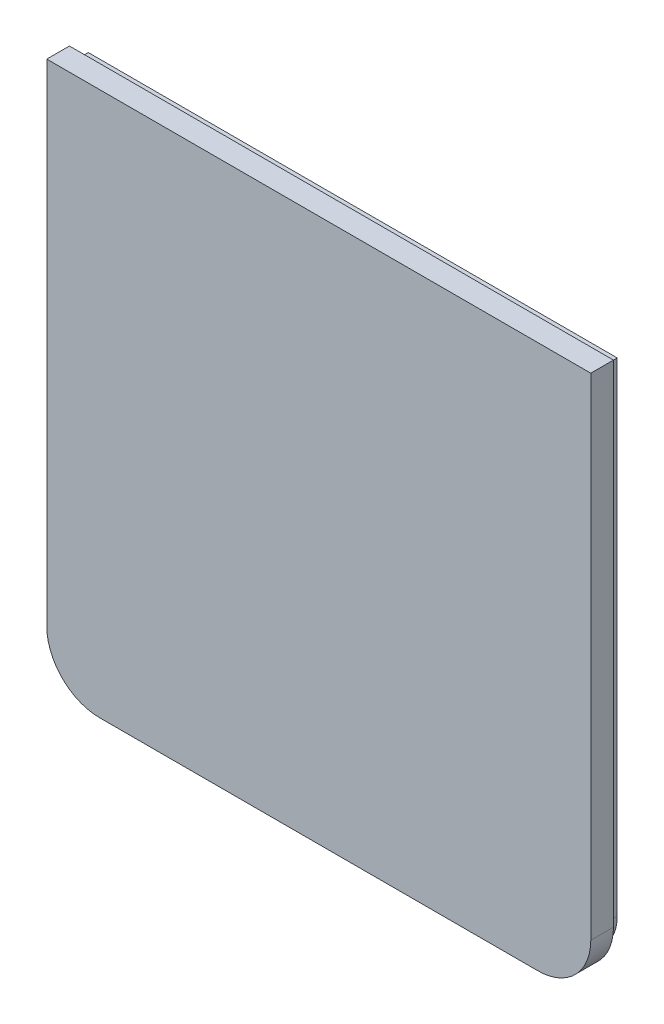
ISO-10303-21;
HEADER;
FILE_DESCRIPTION(('STEP AP214'),'2;1');
FILE_NAME('part.step','',(''),(''),'','','');
FILE_SCHEMA(('AUTOMOTIVE_DESIGN { 1 0 10303 214 1 1 1 1 }'));
ENDSEC;
DATA;
#1=APPLICATION_CONTEXT('core data for automotive mechanical design processes');
#2=APPLICATION_PROTOCOL_DEFINITION('international standard','automotive_design',2000,#1);
#3=PRODUCT_CONTEXT('',#1,'mechanical');
#4=PRODUCT('Part','Part','',(#3));
#5=PRODUCT_RELATED_PRODUCT_CATEGORY('part','',(#4));
#6=PRODUCT_DEFINITION_FORMATION('','',#4);
#7=PRODUCT_DEFINITION_CONTEXT('part definition',#1,'design');
#8=PRODUCT_DEFINITION('design','',#6,#7);
#9=PRODUCT_DEFINITION_SHAPE('','',#8);
#10=(LENGTH_UNIT() NAMED_UNIT(*) SI_UNIT(.MILLI.,.METRE.));
#11=(NAMED_UNIT(*) PLANE_ANGLE_UNIT() SI_UNIT($,.RADIAN.));
#12=(NAMED_UNIT(*) SI_UNIT($,.STERADIAN.) SOLID_ANGLE_UNIT());
#13=UNCERTAINTY_MEASURE_WITH_UNIT(LENGTH_MEASURE(1.E-05),#10,'distance_accuracy_value','');
#14=(GEOMETRIC_REPRESENTATION_CONTEXT(3) GLOBAL_UNCERTAINTY_ASSIGNED_CONTEXT((#13)) GLOBAL_UNIT_ASSIGNED_CONTEXT((#10,
#11,#12)) REPRESENTATION_CONTEXT('',''));
#15=CARTESIAN_POINT('',(0.,0.,0.));
#16=DIRECTION('',(0.,0.,1.));
#17=DIRECTION('',(1.,0.,0.));
#18=AXIS2_PLACEMENT_3D('',#15,#16,#17);
#19=CARTESIAN_POINT('',(-58.,-58.,0.));
#20=DIRECTION('',(0.,0.,-1.));
#21=DIRECTION('',(-1.,0.,0.));
#22=AXIS2_PLACEMENT_3D('',#19,#20,#21);
#23=PLANE('',#22);
#24=DIRECTION('',(0.,1.,0.));
#25=VECTOR('',#24,1.);
#26=CARTESIAN_POINT('',(72.,-57.9999999999999,0.));
#27=LINE('',#26,#25);
#28=CARTESIAN_POINT('',(72.,-58.,0.));
#29=VERTEX_POINT('',#28);
#30=CARTESIAN_POINT('',(72.,72.,0.));
#31=VERTEX_POINT('',#30);
#32=EDGE_CURVE('E258',#29,#31,#27,.T.);
#33=ORIENTED_EDGE('',*,*,#32,.F.);
#34=CARTESIAN_POINT('',(58.,-58.,0.));
#35=DIRECTION('',(0.,0.,1.));
#36=DIRECTION('',(1.,0.,0.));
#37=AXIS2_PLACEMENT_3D('',#34,#35,#36);
#38=CIRCLE('',#37,14.);
#39=CARTESIAN_POINT('',(57.9999999999999,-72.,0.));
#40=VERTEX_POINT('',#39);
#41=EDGE_CURVE('E263',#40,#29,#38,.T.);
#42=ORIENTED_EDGE('',*,*,#41,.F.);
#43=DIRECTION('',(1.,0.,0.));
#44=VECTOR('',#43,1.);
#45=CARTESIAN_POINT('',(-57.9999999999999,-72.,0.));
#46=LINE('',#45,#44);
#47=CARTESIAN_POINT('',(-57.9999999999999,-72.,0.));
#48=VERTEX_POINT('',#47);
#49=EDGE_CURVE('E282',#48,#40,#46,.T.);
#50=ORIENTED_EDGE('',*,*,#49,.F.);
#51=CARTESIAN_POINT('',(-58.,-58.,0.));
#52=DIRECTION('',(0.,0.,1.));
#53=DIRECTION('',(-1.,0.,0.));
#54=AXIS2_PLACEMENT_3D('',#51,#52,#53);
#55=CIRCLE('',#54,14.);
#56=CARTESIAN_POINT('',(-72.,-57.9999999999999,0.));
#57=VERTEX_POINT('',#56);
#58=EDGE_CURVE('E280',#57,#48,#55,.T.);
#59=ORIENTED_EDGE('',*,*,#58,.F.);
#60=DIRECTION('',(0.,-1.,0.));
#61=VECTOR('',#60,1.);
#62=CARTESIAN_POINT('',(-72.,-57.9999999999999,0.));
#63=LINE('',#62,#61);
#64=CARTESIAN_POINT('',(-72.,72.,0.));
#65=VERTEX_POINT('',#64);
#66=EDGE_CURVE('E278',#65,#57,#63,.T.);
#67=ORIENTED_EDGE('',*,*,#66,.F.);
#68=DIRECTION('',(-1.,0.,0.));
#69=VECTOR('',#68,1.);
#70=CARTESIAN_POINT('',(-72.,72.,0.));
#71=LINE('',#70,#69);
#72=EDGE_CURVE('E276',#31,#65,#71,.T.);
#73=ORIENTED_EDGE('',*,*,#72,.F.);
#74=EDGE_LOOP('',(#33,#42,#50,#59,#67,#73));
#75=FACE_BOUND('',#74,.T.);
#76=DIRECTION('',(0.,-1.,0.));
#77=VECTOR('',#76,1.);
#78=CARTESIAN_POINT('',(70.,70.,0.));
#79=LINE('',#78,#77);
#80=CARTESIAN_POINT('',(70.,70.,0.));
#81=VERTEX_POINT('',#80);
#82=CARTESIAN_POINT('',(70.,-58.,0.));
#83=VERTEX_POINT('',#82);
#84=EDGE_CURVE('E235',#81,#83,#79,.T.);
#85=ORIENTED_EDGE('',*,*,#84,.F.);
#86=DIRECTION('',(1.,0.,0.));
#87=VECTOR('',#86,1.);
#88=CARTESIAN_POINT('',(-70.,70.,0.));
#89=LINE('',#88,#87);
#90=CARTESIAN_POINT('',(-70.,70.,0.));
#91=VERTEX_POINT('',#90);
#92=EDGE_CURVE('E181',#91,#81,#89,.T.);
#93=ORIENTED_EDGE('',*,*,#92,.F.);
#94=DIRECTION('',(0.,1.,0.));
#95=VECTOR('',#94,1.);
#96=CARTESIAN_POINT('',(-70.,-58.,0.));
#97=LINE('',#96,#95);
#98=CARTESIAN_POINT('',(-70.,-58.,0.));
#99=VERTEX_POINT('',#98);
#100=EDGE_CURVE('E222',#99,#91,#97,.T.);
#101=ORIENTED_EDGE('',*,*,#100,.F.);
#102=CARTESIAN_POINT('',(-58.,-58.,0.));
#103=DIRECTION('',(0.,0.,-1.));
#104=DIRECTION('',(-1.,0.,0.));
#105=AXIS2_PLACEMENT_3D('',#102,#103,#104);
#106=CIRCLE('',#105,12.);
#107=CARTESIAN_POINT('',(-57.9999999999999,-70.,0.));
#108=VERTEX_POINT('',#107);
#109=EDGE_CURVE('E241',#108,#99,#106,.T.);
#110=ORIENTED_EDGE('',*,*,#109,.F.);
#111=DIRECTION('',(-1.,0.,0.));
#112=VECTOR('',#111,1.);
#113=CARTESIAN_POINT('',(58.,-70.,0.));
#114=LINE('',#113,#112);
#115=CARTESIAN_POINT('',(58.,-70.,0.));
#116=VERTEX_POINT('',#115);
#117=EDGE_CURVE('E239',#116,#108,#114,.T.);
#118=ORIENTED_EDGE('',*,*,#117,.F.);
#119=CARTESIAN_POINT('',(58.,-58.,0.));
#120=DIRECTION('',(0.,0.,-1.));
#121=DIRECTION('',(-1.,0.,0.));
#122=AXIS2_PLACEMENT_3D('',#119,#120,#121);
#123=CIRCLE('',#122,12.);
#124=EDGE_CURVE('E237',#83,#116,#123,.T.);
#125=ORIENTED_EDGE('',*,*,#124,.F.);
#126=EDGE_LOOP('',(#85,#93,#101,#110,#118,#125));
#127=FACE_BOUND('',#126,.T.);
#128=ADVANCED_FACE('F37',(#75,#127),#23,.T.);
#129=CARTESIAN_POINT('',(72.,-57.9999999999999,6.));
#130=DIRECTION('',(-1.,0.,0.));
#131=DIRECTION('',(0.,0.,1.));
#132=AXIS2_PLACEMENT_3D('',#129,#130,#131);
#133=PLANE('',#132);
#134=ORIENTED_EDGE('',*,*,#32,.T.);
#135=DIRECTION('',(0.,0.,-1.));
#136=VECTOR('',#135,1.);
#137=CARTESIAN_POINT('',(72.,72.,6.));
#138=LINE('',#137,#136);
#139=CARTESIAN_POINT('',(72.,72.,6.));
#140=VERTEX_POINT('',#139);
#141=EDGE_CURVE('E11',#140,#31,#138,.T.);
#142=ORIENTED_EDGE('',*,*,#141,.F.);
#143=DIRECTION('',(0.,1.,0.));
#144=VECTOR('',#143,1.);
#145=CARTESIAN_POINT('',(72.,-57.9999999999999,6.));
#146=LINE('',#145,#144);
#147=CARTESIAN_POINT('',(72.,-58.,6.));
#148=VERTEX_POINT('',#147);
#149=EDGE_CURVE('E259',#148,#140,#146,.T.);
#150=ORIENTED_EDGE('',*,*,#149,.F.);
#151=DIRECTION('',(0.,0.,-1.));
#152=VECTOR('',#151,1.);
#153=CARTESIAN_POINT('',(72.,-58.,6.));
#154=LINE('',#153,#152);
#155=EDGE_CURVE('E273',#148,#29,#154,.T.);
#156=ORIENTED_EDGE('',*,*,#155,.T.);
#157=EDGE_LOOP('',(#134,#142,#150,#156));
#158=FACE_BOUND('',#157,.T.);
#159=ADVANCED_FACE('F39',(#158),#133,.F.);
#160=CARTESIAN_POINT('',(-72.,72.,6.));
#161=DIRECTION('',(0.,-1.,0.));
#162=DIRECTION('',(0.,0.,-1.));
#163=AXIS2_PLACEMENT_3D('',#160,#161,#162);
#164=PLANE('',#163);
#165=ORIENTED_EDGE('',*,*,#72,.T.);
#166=DIRECTION('',(0.,0.,-1.));
#167=VECTOR('',#166,1.);
#168=CARTESIAN_POINT('',(-72.,72.,6.));
#169=LINE('',#168,#167);
#170=CARTESIAN_POINT('',(-72.,72.,6.));
#171=VERTEX_POINT('',#170);
#172=EDGE_CURVE('E45',#171,#65,#169,.T.);
#173=ORIENTED_EDGE('',*,*,#172,.F.);
#174=DIRECTION('',(-1.,0.,0.));
#175=VECTOR('',#174,1.);
#176=CARTESIAN_POINT('',(-72.,72.,6.));
#177=LINE('',#176,#175);
#178=EDGE_CURVE('E262',#140,#171,#177,.T.);
#179=ORIENTED_EDGE('',*,*,#178,.F.);
#180=ORIENTED_EDGE('',*,*,#141,.T.);
#181=EDGE_LOOP('',(#165,#173,#179,#180));
#182=FACE_BOUND('',#181,.T.);
#183=ADVANCED_FACE('F323',(#182),#164,.F.);
#184=CARTESIAN_POINT('',(-72.,-57.9999999999999,6.));
#185=DIRECTION('',(1.,0.,0.));
#186=DIRECTION('',(0.,0.,-1.));
#187=AXIS2_PLACEMENT_3D('',#184,#185,#186);
#188=PLANE('',#187);
#189=ORIENTED_EDGE('',*,*,#66,.T.);
#190=DIRECTION('',(0.,0.,-1.));
#191=VECTOR('',#190,1.);
#192=CARTESIAN_POINT('',(-72.,-57.9999999999999,6.));
#193=LINE('',#192,#191);
#194=CARTESIAN_POINT('',(-72.,-57.9999999999999,6.));
#195=VERTEX_POINT('',#194);
#196=EDGE_CURVE('E293',#195,#57,#193,.T.);
#197=ORIENTED_EDGE('',*,*,#196,.F.);
#198=DIRECTION('',(0.,-1.,0.));
#199=VECTOR('',#198,1.);
#200=CARTESIAN_POINT('',(-72.,-57.9999999999999,6.));
#201=LINE('',#200,#199);
#202=EDGE_CURVE('E265',#171,#195,#201,.T.);
#203=ORIENTED_EDGE('',*,*,#202,.F.);
#204=ORIENTED_EDGE('',*,*,#172,.T.);
#205=EDGE_LOOP('',(#189,#197,#203,#204));
#206=FACE_BOUND('',#205,.T.);
#207=ADVANCED_FACE('F300',(#206),#188,.F.);
#208=CARTESIAN_POINT('',(-58.,-58.,6.));
#209=DIRECTION('',(0.,0.,-1.));
#210=DIRECTION('',(-1.,0.,0.));
#211=AXIS2_PLACEMENT_3D('',#208,#209,#210);
#212=CYLINDRICAL_SURFACE('',#211,14.);
#213=ORIENTED_EDGE('',*,*,#58,.T.);
#214=DIRECTION('',(0.,0.,-1.));
#215=VECTOR('',#214,1.);
#216=CARTESIAN_POINT('',(-57.9999999999999,-72.,6.));
#217=LINE('',#216,#215);
#218=CARTESIAN_POINT('',(-57.9999999999999,-72.,6.));
#219=VERTEX_POINT('',#218);
#220=EDGE_CURVE('E290',#219,#48,#217,.T.);
#221=ORIENTED_EDGE('',*,*,#220,.F.);
#222=CARTESIAN_POINT('',(-58.,-58.,6.));
#223=DIRECTION('',(0.,0.,1.));
#224=DIRECTION('',(-1.,0.,0.));
#225=AXIS2_PLACEMENT_3D('',#222,#223,#224);
#226=CIRCLE('',#225,14.);
#227=EDGE_CURVE('E267',#195,#219,#226,.T.);
#228=ORIENTED_EDGE('',*,*,#227,.F.);
#229=ORIENTED_EDGE('',*,*,#196,.T.);
#230=EDGE_LOOP('',(#213,#221,#228,#229));
#231=FACE_BOUND('',#230,.T.);
#232=ADVANCED_FACE('F311',(#231),#212,.T.);
#233=CARTESIAN_POINT('',(-57.9999999999999,-72.,6.));
#234=DIRECTION('',(0.,1.,0.));
#235=DIRECTION('',(0.,0.,1.));
#236=AXIS2_PLACEMENT_3D('',#233,#234,#235);
#237=PLANE('',#236);
#238=ORIENTED_EDGE('',*,*,#49,.T.);
#239=DIRECTION('',(0.,0.,-1.));
#240=VECTOR('',#239,1.);
#241=CARTESIAN_POINT('',(57.9999999999999,-72.,6.));
#242=LINE('',#241,#240);
#243=CARTESIAN_POINT('',(57.9999999999999,-72.,6.));
#244=VERTEX_POINT('',#243);
#245=EDGE_CURVE('E287',#244,#40,#242,.T.);
#246=ORIENTED_EDGE('',*,*,#245,.F.);
#247=DIRECTION('',(1.,0.,0.));
#248=VECTOR('',#247,1.);
#249=CARTESIAN_POINT('',(-57.9999999999999,-72.,6.));
#250=LINE('',#249,#248);
#251=EDGE_CURVE('E269',#219,#244,#250,.T.);
#252=ORIENTED_EDGE('',*,*,#251,.F.);
#253=ORIENTED_EDGE('',*,*,#220,.T.);
#254=EDGE_LOOP('',(#238,#246,#252,#253));
#255=FACE_BOUND('',#254,.T.);
#256=ADVANCED_FACE('F315',(#255),#237,.F.);
#257=CARTESIAN_POINT('',(58.,-58.,6.));
#258=DIRECTION('',(0.,0.,-1.));
#259=DIRECTION('',(-1.,0.,0.));
#260=AXIS2_PLACEMENT_3D('',#257,#258,#259);
#261=CYLINDRICAL_SURFACE('',#260,14.);
#262=ORIENTED_EDGE('',*,*,#41,.T.);
#263=ORIENTED_EDGE('',*,*,#155,.F.);
#264=CARTESIAN_POINT('',(58.,-58.,6.));
#265=DIRECTION('',(0.,0.,1.));
#266=DIRECTION('',(1.,0.,0.));
#267=AXIS2_PLACEMENT_3D('',#264,#265,#266);
#268=CIRCLE('',#267,14.);
#269=EDGE_CURVE('E271',#244,#148,#268,.T.);
#270=ORIENTED_EDGE('',*,*,#269,.F.);
#271=ORIENTED_EDGE('',*,*,#245,.T.);
#272=EDGE_LOOP('',(#262,#263,#270,#271));
#273=FACE_BOUND('',#272,.T.);
#274=ADVANCED_FACE('F326',(#273),#261,.T.);
#275=CARTESIAN_POINT('',(-58.,-58.,6.));
#276=DIRECTION('',(0.,0.,-1.));
#277=DIRECTION('',(-1.,0.,0.));
#278=AXIS2_PLACEMENT_3D('',#275,#276,#277);
#279=PLANE('',#278);
#280=ORIENTED_EDGE('',*,*,#149,.T.);
#281=ORIENTED_EDGE('',*,*,#178,.T.);
#282=ORIENTED_EDGE('',*,*,#202,.T.);
#283=ORIENTED_EDGE('',*,*,#227,.T.);
#284=ORIENTED_EDGE('',*,*,#251,.T.);
#285=ORIENTED_EDGE('',*,*,#269,.T.);
#286=EDGE_LOOP('',(#280,#281,#282,#283,#284,#285));
#287=FACE_BOUND('',#286,.T.);
#288=ADVANCED_FACE('F319',(#287),#279,.F.);
#289=CARTESIAN_POINT('',(58.,-58.,-3.));
#290=DIRECTION('',(0.,0.,-1.));
#291=DIRECTION('',(-1.,0.,0.));
#292=AXIS2_PLACEMENT_3D('',#289,#290,#291);
#293=PLANE('',#292);
#294=DIRECTION('',(1.,0.,0.));
#295=VECTOR('',#294,1.);
#296=CARTESIAN_POINT('',(-70.,70.,-3.));
#297=LINE('',#296,#295);
#298=CARTESIAN_POINT('',(-70.,70.,-3.));
#299=VERTEX_POINT('',#298);
#300=CARTESIAN_POINT('',(70.,70.,-3.));
#301=VERTEX_POINT('',#300);
#302=EDGE_CURVE('E218',#299,#301,#297,.T.);
#303=ORIENTED_EDGE('',*,*,#302,.T.);
#304=DIRECTION('',(0.,-1.,0.));
#305=VECTOR('',#304,1.);
#306=CARTESIAN_POINT('',(70.,70.,-3.));
#307=LINE('',#306,#305);
#308=CARTESIAN_POINT('',(70.,-58.,-3.));
#309=VERTEX_POINT('',#308);
#310=EDGE_CURVE('E221',#301,#309,#307,.T.);
#311=ORIENTED_EDGE('',*,*,#310,.T.);
#312=CARTESIAN_POINT('',(58.,-58.,-3.));
#313=DIRECTION('',(0.,0.,-1.));
#314=DIRECTION('',(-1.,0.,0.));
#315=AXIS2_PLACEMENT_3D('',#312,#313,#314);
#316=CIRCLE('',#315,12.);
#317=CARTESIAN_POINT('',(58.,-70.,-3.));
#318=VERTEX_POINT('',#317);
#319=EDGE_CURVE('E224',#309,#318,#316,.T.);
#320=ORIENTED_EDGE('',*,*,#319,.T.);
#321=DIRECTION('',(-1.,0.,0.));
#322=VECTOR('',#321,1.);
#323=CARTESIAN_POINT('',(58.,-70.,-3.));
#324=LINE('',#323,#322);
#325=CARTESIAN_POINT('',(-57.9999999999999,-70.,-3.));
#326=VERTEX_POINT('',#325);
#327=EDGE_CURVE('E226',#318,#326,#324,.T.);
#328=ORIENTED_EDGE('',*,*,#327,.T.);
#329=CARTESIAN_POINT('',(-58.,-58.,-3.));
#330=DIRECTION('',(0.,0.,-1.));
#331=DIRECTION('',(-1.,0.,0.));
#332=AXIS2_PLACEMENT_3D('',#329,#330,#331);
#333=CIRCLE('',#332,12.);
#334=CARTESIAN_POINT('',(-70.,-58.,-3.));
#335=VERTEX_POINT('',#334);
#336=EDGE_CURVE('E228',#326,#335,#333,.T.);
#337=ORIENTED_EDGE('',*,*,#336,.T.);
#338=DIRECTION('',(0.,1.,0.));
#339=VECTOR('',#338,1.);
#340=CARTESIAN_POINT('',(-70.,-58.,-3.));
#341=LINE('',#340,#339);
#342=EDGE_CURVE('E230',#335,#299,#341,.T.);
#343=ORIENTED_EDGE('',*,*,#342,.T.);
#344=EDGE_LOOP('',(#303,#311,#320,#328,#337,#343));
#345=FACE_BOUND('',#344,.T.);
#346=DIRECTION('',(0.,-1.,0.));
#347=VECTOR('',#346,1.);
#348=CARTESIAN_POINT('',(67.,67.,-3.));
#349=LINE('',#348,#347);
#350=CARTESIAN_POINT('',(67.,67.,-3.));
#351=VERTEX_POINT('',#350);
#352=CARTESIAN_POINT('',(67.,-58.,-3.));
#353=VERTEX_POINT('',#352);
#354=EDGE_CURVE('E173',#351,#353,#349,.T.);
#355=ORIENTED_EDGE('',*,*,#354,.F.);
#356=DIRECTION('',(1.,0.,0.));
#357=VECTOR('',#356,1.);
#358=CARTESIAN_POINT('',(-66.9999999999999,67.,-3.));
#359=LINE('',#358,#357);
#360=CARTESIAN_POINT('',(-66.9999999999999,67.,-3.));
#361=VERTEX_POINT('',#360);
#362=EDGE_CURVE('E164',#361,#351,#359,.T.);
#363=ORIENTED_EDGE('',*,*,#362,.F.);
#364=DIRECTION('',(0.,1.,0.));
#365=VECTOR('',#364,1.);
#366=CARTESIAN_POINT('',(-66.9999999999999,-58.,-3.));
#367=LINE('',#366,#365);
#368=CARTESIAN_POINT('',(-66.9999999999999,-58.,-3.));
#369=VERTEX_POINT('',#368);
#370=EDGE_CURVE('E196',#369,#361,#367,.T.);
#371=ORIENTED_EDGE('',*,*,#370,.F.);
#372=CARTESIAN_POINT('',(-58.,-58.,-3.));
#373=DIRECTION('',(0.,0.,-1.));
#374=DIRECTION('',(-1.,0.,0.));
#375=AXIS2_PLACEMENT_3D('',#372,#373,#374);
#376=CIRCLE('',#375,8.99999999999999);
#377=CARTESIAN_POINT('',(-57.9999999999999,-67.,-3.));
#378=VERTEX_POINT('',#377);
#379=EDGE_CURVE('E193',#378,#369,#376,.T.);
#380=ORIENTED_EDGE('',*,*,#379,.F.);
#381=DIRECTION('',(-1.,0.,0.));
#382=VECTOR('',#381,1.);
#383=CARTESIAN_POINT('',(58.,-67.,-3.));
#384=LINE('',#383,#382);
#385=CARTESIAN_POINT('',(58.,-67.,-3.));
#386=VERTEX_POINT('',#385);
#387=EDGE_CURVE('E189',#386,#378,#384,.T.);
#388=ORIENTED_EDGE('',*,*,#387,.F.);
#389=CARTESIAN_POINT('',(58.,-58.,-3.));
#390=DIRECTION('',(0.,0.,-1.));
#391=DIRECTION('',(-1.,0.,0.));
#392=AXIS2_PLACEMENT_3D('',#389,#390,#391);
#393=CIRCLE('',#392,8.99999999999999);
#394=EDGE_CURVE('E187',#353,#386,#393,.T.);
#395=ORIENTED_EDGE('',*,*,#394,.F.);
#396=EDGE_LOOP('',(#355,#363,#371,#380,#388,#395));
#397=FACE_BOUND('',#396,.T.);
#398=ADVANCED_FACE('F185',(#345,#397),#293,.T.);
#399=CARTESIAN_POINT('',(-70.,70.,-3.));
#400=DIRECTION('',(0.,-1.,0.));
#401=DIRECTION('',(0.,0.,-1.));
#402=AXIS2_PLACEMENT_3D('',#399,#400,#401);
#403=PLANE('',#402);
#404=ORIENTED_EDGE('',*,*,#92,.T.);
#405=DIRECTION('',(0.,0.,1.));
#406=VECTOR('',#405,1.);
#407=CARTESIAN_POINT('',(70.,70.,-3.));
#408=LINE('',#407,#406);
#409=EDGE_CURVE('E256',#301,#81,#408,.T.);
#410=ORIENTED_EDGE('',*,*,#409,.F.);
#411=ORIENTED_EDGE('',*,*,#302,.F.);
#412=DIRECTION('',(0.,0.,1.));
#413=VECTOR('',#412,1.);
#414=CARTESIAN_POINT('',(-70.,70.,-3.));
#415=LINE('',#414,#413);
#416=EDGE_CURVE('E232',#299,#91,#415,.T.);
#417=ORIENTED_EDGE('',*,*,#416,.T.);
#418=EDGE_LOOP('',(#404,#410,#411,#417));
#419=FACE_BOUND('',#418,.T.);
#420=ADVANCED_FACE('F371',(#419),#403,.F.);
#421=CARTESIAN_POINT('',(70.,70.,-3.));
#422=DIRECTION('',(-1.,0.,0.));
#423=DIRECTION('',(0.,0.,1.));
#424=AXIS2_PLACEMENT_3D('',#421,#422,#423);
#425=PLANE('',#424);
#426=ORIENTED_EDGE('',*,*,#84,.T.);
#427=DIRECTION('',(0.,0.,1.));
#428=VECTOR('',#427,1.);
#429=CARTESIAN_POINT('',(70.,-58.,-3.));
#430=LINE('',#429,#428);
#431=EDGE_CURVE('E253',#309,#83,#430,.T.);
#432=ORIENTED_EDGE('',*,*,#431,.F.);
#433=ORIENTED_EDGE('',*,*,#310,.F.);
#434=ORIENTED_EDGE('',*,*,#409,.T.);
#435=EDGE_LOOP('',(#426,#432,#433,#434));
#436=FACE_BOUND('',#435,.T.);
#437=ADVANCED_FACE('F386',(#436),#425,.F.);
#438=CARTESIAN_POINT('',(58.,-58.,-3.));
#439=DIRECTION('',(0.,0.,1.));
#440=DIRECTION('',(1.,0.,0.));
#441=AXIS2_PLACEMENT_3D('',#438,#439,#440);
#442=CYLINDRICAL_SURFACE('',#441,12.);
#443=ORIENTED_EDGE('',*,*,#124,.T.);
#444=DIRECTION('',(0.,0.,1.));
#445=VECTOR('',#444,1.);
#446=CARTESIAN_POINT('',(58.,-70.,-3.));
#447=LINE('',#446,#445);
#448=EDGE_CURVE('E250',#318,#116,#447,.T.);
#449=ORIENTED_EDGE('',*,*,#448,.F.);
#450=ORIENTED_EDGE('',*,*,#319,.F.);
#451=ORIENTED_EDGE('',*,*,#431,.T.);
#452=EDGE_LOOP('',(#443,#449,#450,#451));
#453=FACE_BOUND('',#452,.T.);
#454=ADVANCED_FACE('F382',(#453),#442,.T.);
#455=CARTESIAN_POINT('',(58.,-70.,-3.));
#456=DIRECTION('',(0.,1.,0.));
#457=DIRECTION('',(0.,0.,1.));
#458=AXIS2_PLACEMENT_3D('',#455,#456,#457);
#459=PLANE('',#458);
#460=ORIENTED_EDGE('',*,*,#117,.T.);
#461=DIRECTION('',(0.,0.,1.));
#462=VECTOR('',#461,1.);
#463=CARTESIAN_POINT('',(-57.9999999999999,-70.,-3.));
#464=LINE('',#463,#462);
#465=EDGE_CURVE('E247',#326,#108,#464,.T.);
#466=ORIENTED_EDGE('',*,*,#465,.F.);
#467=ORIENTED_EDGE('',*,*,#327,.F.);
#468=ORIENTED_EDGE('',*,*,#448,.T.);
#469=EDGE_LOOP('',(#460,#466,#467,#468));
#470=FACE_BOUND('',#469,.T.);
#471=ADVANCED_FACE('F378',(#470),#459,.F.);
#472=CARTESIAN_POINT('',(-58.,-58.,-3.));
#473=DIRECTION('',(0.,0.,1.));
#474=DIRECTION('',(1.,0.,0.));
#475=AXIS2_PLACEMENT_3D('',#472,#473,#474);
#476=CYLINDRICAL_SURFACE('',#475,12.);
#477=ORIENTED_EDGE('',*,*,#109,.T.);
#478=DIRECTION('',(0.,0.,1.));
#479=VECTOR('',#478,1.);
#480=CARTESIAN_POINT('',(-70.,-58.,-3.));
#481=LINE('',#480,#479);
#482=EDGE_CURVE('E52',#335,#99,#481,.T.);
#483=ORIENTED_EDGE('',*,*,#482,.F.);
#484=ORIENTED_EDGE('',*,*,#336,.F.);
#485=ORIENTED_EDGE('',*,*,#465,.T.);
#486=EDGE_LOOP('',(#477,#483,#484,#485));
#487=FACE_BOUND('',#486,.T.);
#488=ADVANCED_FACE('F375',(#487),#476,.T.);
#489=CARTESIAN_POINT('',(-70.,-58.,-3.));
#490=DIRECTION('',(1.,0.,0.));
#491=DIRECTION('',(0.,0.,-1.));
#492=AXIS2_PLACEMENT_3D('',#489,#490,#491);
#493=PLANE('',#492);
#494=ORIENTED_EDGE('',*,*,#100,.T.);
#495=ORIENTED_EDGE('',*,*,#416,.F.);
#496=ORIENTED_EDGE('',*,*,#342,.F.);
#497=ORIENTED_EDGE('',*,*,#482,.T.);
#498=EDGE_LOOP('',(#494,#495,#496,#497));
#499=FACE_BOUND('',#498,.T.);
#500=ADVANCED_FACE('F368',(#499),#493,.F.);
#501=CARTESIAN_POINT('',(-66.9999999999999,67.,-3.));
#502=DIRECTION('',(0.,-1.,0.));
#503=DIRECTION('',(0.,0.,-1.));
#504=AXIS2_PLACEMENT_3D('',#501,#502,#503);
#505=PLANE('',#504);
#506=DIRECTION('',(1.,0.,0.));
#507=VECTOR('',#506,1.);
#508=CARTESIAN_POINT('',(-66.9999999999999,67.,0.));
#509=LINE('',#508,#507);
#510=CARTESIAN_POINT('',(-66.9999999999999,67.,0.));
#511=VERTEX_POINT('',#510);
#512=CARTESIAN_POINT('',(67.,67.,0.));
#513=VERTEX_POINT('',#512);
#514=EDGE_CURVE('E60',#511,#513,#509,.T.);
#515=ORIENTED_EDGE('',*,*,#514,.F.);
#516=DIRECTION('',(0.,0.,1.));
#517=VECTOR('',#516,1.);
#518=CARTESIAN_POINT('',(-66.9999999999999,67.,-3.));
#519=LINE('',#518,#517);
#520=EDGE_CURVE('E169',#361,#511,#519,.T.);
#521=ORIENTED_EDGE('',*,*,#520,.F.);
#522=ORIENTED_EDGE('',*,*,#362,.T.);
#523=DIRECTION('',(0.,0.,1.));
#524=VECTOR('',#523,1.);
#525=CARTESIAN_POINT('',(67.,67.,-3.));
#526=LINE('',#525,#524);
#527=EDGE_CURVE('E167',#351,#513,#526,.T.);
#528=ORIENTED_EDGE('',*,*,#527,.T.);
#529=EDGE_LOOP('',(#515,#521,#522,#528));
#530=FACE_BOUND('',#529,.T.);
#531=ADVANCED_FACE('F166',(#530),#505,.T.);
#532=CARTESIAN_POINT('',(67.,67.,-3.));
#533=DIRECTION('',(-1.,0.,0.));
#534=DIRECTION('',(0.,0.,1.));
#535=AXIS2_PLACEMENT_3D('',#532,#533,#534);
#536=PLANE('',#535);
#537=DIRECTION('',(0.,-1.,0.));
#538=VECTOR('',#537,1.);
#539=CARTESIAN_POINT('',(67.,67.,0.));
#540=LINE('',#539,#538);
#541=CARTESIAN_POINT('',(67.,-58.,0.));
#542=VERTEX_POINT('',#541);
#543=EDGE_CURVE('E180',#513,#542,#540,.T.);
#544=ORIENTED_EDGE('',*,*,#543,.F.);
#545=ORIENTED_EDGE('',*,*,#527,.F.);
#546=ORIENTED_EDGE('',*,*,#354,.T.);
#547=DIRECTION('',(0.,0.,1.));
#548=VECTOR('',#547,1.);
#549=CARTESIAN_POINT('',(67.,-58.,-3.));
#550=LINE('',#549,#548);
#551=EDGE_CURVE('E182',#353,#542,#550,.T.);
#552=ORIENTED_EDGE('',*,*,#551,.T.);
#553=EDGE_LOOP('',(#544,#545,#546,#552));
#554=FACE_BOUND('',#553,.T.);
#555=ADVANCED_FACE('F177',(#554),#536,.T.);
#556=CARTESIAN_POINT('',(58.,-58.,-3.));
#557=DIRECTION('',(0.,0.,1.));
#558=DIRECTION('',(1.,0.,0.));
#559=AXIS2_PLACEMENT_3D('',#556,#557,#558);
#560=CYLINDRICAL_SURFACE('',#559,8.99999999999999);
#561=CARTESIAN_POINT('',(58.,-58.,0.));
#562=DIRECTION('',(0.,0.,-1.));
#563=DIRECTION('',(-1.,0.,0.));
#564=AXIS2_PLACEMENT_3D('',#561,#562,#563);
#565=CIRCLE('',#564,8.99999999999999);
#566=CARTESIAN_POINT('',(58.,-67.,0.));
#567=VERTEX_POINT('',#566);
#568=EDGE_CURVE('E200',#542,#567,#565,.T.);
#569=ORIENTED_EDGE('',*,*,#568,.F.);
#570=ORIENTED_EDGE('',*,*,#551,.F.);
#571=ORIENTED_EDGE('',*,*,#394,.T.);
#572=DIRECTION('',(0.,0.,1.));
#573=VECTOR('',#572,1.);
#574=CARTESIAN_POINT('',(58.,-67.,-3.));
#575=LINE('',#574,#573);
#576=EDGE_CURVE('E214',#386,#567,#575,.T.);
#577=ORIENTED_EDGE('',*,*,#576,.T.);
#578=EDGE_LOOP('',(#569,#570,#571,#577));
#579=FACE_BOUND('',#578,.T.);
#580=ADVANCED_FACE('F359',(#579),#560,.F.);
#581=CARTESIAN_POINT('',(58.,-67.,-3.));
#582=DIRECTION('',(0.,1.,0.));
#583=DIRECTION('',(0.,0.,1.));
#584=AXIS2_PLACEMENT_3D('',#581,#582,#583);
#585=PLANE('',#584);
#586=DIRECTION('',(-1.,0.,0.));
#587=VECTOR('',#586,1.);
#588=CARTESIAN_POINT('',(58.,-67.,0.));
#589=LINE('',#588,#587);
#590=CARTESIAN_POINT('',(-57.9999999999999,-67.,0.));
#591=VERTEX_POINT('',#590);
#592=EDGE_CURVE('E202',#567,#591,#589,.T.);
#593=ORIENTED_EDGE('',*,*,#592,.F.);
#594=ORIENTED_EDGE('',*,*,#576,.F.);
#595=ORIENTED_EDGE('',*,*,#387,.T.);
#596=DIRECTION('',(0.,0.,1.));
#597=VECTOR('',#596,1.);
#598=CARTESIAN_POINT('',(-57.9999999999999,-67.,-3.));
#599=LINE('',#598,#597);
#600=EDGE_CURVE('E211',#378,#591,#599,.T.);
#601=ORIENTED_EDGE('',*,*,#600,.T.);
#602=EDGE_LOOP('',(#593,#594,#595,#601));
#603=FACE_BOUND('',#602,.T.);
#604=ADVANCED_FACE('F352',(#603),#585,.T.);
#605=CARTESIAN_POINT('',(-58.,-58.,-3.));
#606=DIRECTION('',(0.,0.,1.));
#607=DIRECTION('',(1.,0.,0.));
#608=AXIS2_PLACEMENT_3D('',#605,#606,#607);
#609=CYLINDRICAL_SURFACE('',#608,8.99999999999999);
#610=CARTESIAN_POINT('',(-58.,-58.,0.));
#611=DIRECTION('',(0.,0.,-1.));
#612=DIRECTION('',(-1.,0.,0.));
#613=AXIS2_PLACEMENT_3D('',#610,#611,#612);
#614=CIRCLE('',#613,8.99999999999999);
#615=CARTESIAN_POINT('',(-66.9999999999999,-58.,0.));
#616=VERTEX_POINT('',#615);
#617=EDGE_CURVE('E204',#591,#616,#614,.T.);
#618=ORIENTED_EDGE('',*,*,#617,.F.);
#619=ORIENTED_EDGE('',*,*,#600,.F.);
#620=ORIENTED_EDGE('',*,*,#379,.T.);
#621=DIRECTION('',(0.,0.,1.));
#622=VECTOR('',#621,1.);
#623=CARTESIAN_POINT('',(-66.9999999999999,-58.,-3.));
#624=LINE('',#623,#622);
#625=EDGE_CURVE('E208',#369,#616,#624,.T.);
#626=ORIENTED_EDGE('',*,*,#625,.T.);
#627=EDGE_LOOP('',(#618,#619,#620,#626));
#628=FACE_BOUND('',#627,.T.);
#629=ADVANCED_FACE('F346',(#628),#609,.F.);
#630=CARTESIAN_POINT('',(-66.9999999999999,-58.,-3.));
#631=DIRECTION('',(1.,0.,0.));
#632=DIRECTION('',(0.,0.,-1.));
#633=AXIS2_PLACEMENT_3D('',#630,#631,#632);
#634=PLANE('',#633);
#635=DIRECTION('',(0.,1.,0.));
#636=VECTOR('',#635,1.);
#637=CARTESIAN_POINT('',(-66.9999999999999,-58.,0.));
#638=LINE('',#637,#636);
#639=EDGE_CURVE('E174',#616,#511,#638,.T.);
#640=ORIENTED_EDGE('',*,*,#639,.F.);
#641=ORIENTED_EDGE('',*,*,#625,.F.);
#642=ORIENTED_EDGE('',*,*,#370,.T.);
#643=ORIENTED_EDGE('',*,*,#520,.T.);
#644=EDGE_LOOP('',(#640,#641,#642,#643));
#645=FACE_BOUND('',#644,.T.);
#646=ADVANCED_FACE('F342',(#645),#634,.T.);
#647=ORIENTED_EDGE('',*,*,#514,.T.);
#648=ORIENTED_EDGE('',*,*,#543,.T.);
#649=ORIENTED_EDGE('',*,*,#568,.T.);
#650=ORIENTED_EDGE('',*,*,#592,.T.);
#651=ORIENTED_EDGE('',*,*,#617,.T.);
#652=ORIENTED_EDGE('',*,*,#639,.T.);
#653=EDGE_LOOP('',(#647,#648,#649,#650,#651,#652));
#654=FACE_BOUND('',#653,.T.);
#655=ADVANCED_FACE('F337',(#654),#23,.T.);
#656=CLOSED_SHELL('',(#128,#159,#183,#207,#232,#256,#274,#288,#398,#420,#437,#454,#471,#488,
#500,#531,#555,#580,#604,#629,#646,#655));
#657=MANIFOLD_SOLID_BREP('B2',#656);
#658=ADVANCED_BREP_SHAPE_REPRESENTATION('',(#18,#657),#14);
#659=SHAPE_DEFINITION_REPRESENTATION(#9,#658);
ENDSEC;
END-ISO-10303-21;
